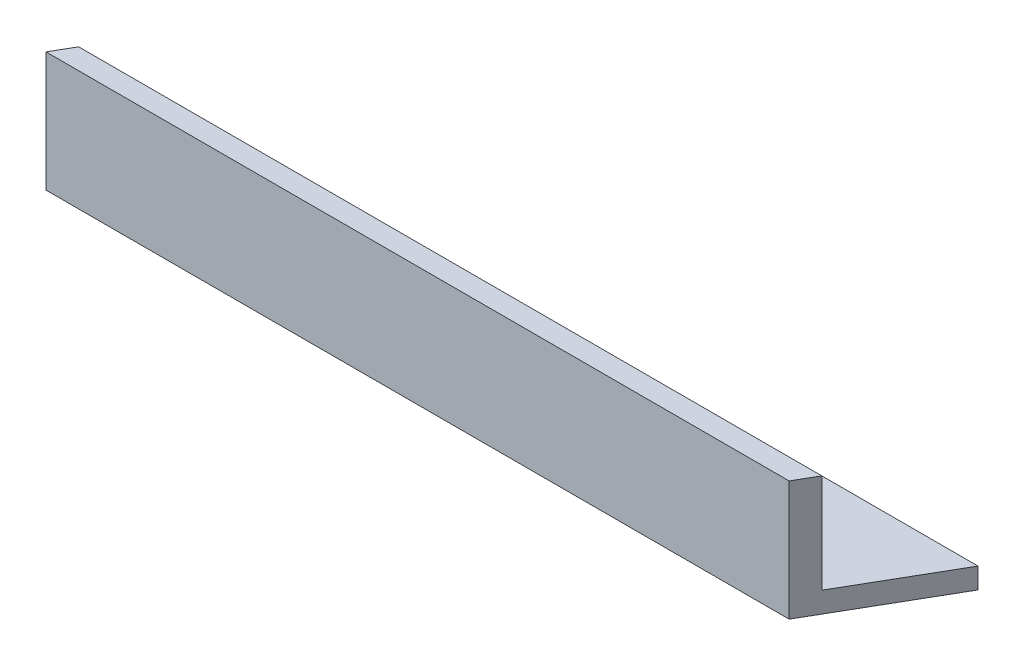
ISO-10303-21;
HEADER;
FILE_DESCRIPTION(('STEP AP214'),'2;1');
FILE_NAME('part.step','',(''),(''),'','','');
FILE_SCHEMA(('AUTOMOTIVE_DESIGN { 1 0 10303 214 1 1 1 1 }'));
ENDSEC;
DATA;
#1=APPLICATION_CONTEXT('core data for automotive mechanical design processes');
#2=APPLICATION_PROTOCOL_DEFINITION('international standard','automotive_design',2000,#1);
#3=PRODUCT_CONTEXT('',#1,'mechanical');
#4=PRODUCT('Part','Part','',(#3));
#5=PRODUCT_RELATED_PRODUCT_CATEGORY('part','',(#4));
#6=PRODUCT_DEFINITION_FORMATION('','',#4);
#7=PRODUCT_DEFINITION_CONTEXT('part definition',#1,'design');
#8=PRODUCT_DEFINITION('design','',#6,#7);
#9=PRODUCT_DEFINITION_SHAPE('','',#8);
#10=(LENGTH_UNIT() NAMED_UNIT(*) SI_UNIT(.MILLI.,.METRE.));
#11=(NAMED_UNIT(*) PLANE_ANGLE_UNIT() SI_UNIT($,.RADIAN.));
#12=(NAMED_UNIT(*) SI_UNIT($,.STERADIAN.) SOLID_ANGLE_UNIT());
#13=UNCERTAINTY_MEASURE_WITH_UNIT(LENGTH_MEASURE(1.E-05),#10,'distance_accuracy_value','');
#14=(GEOMETRIC_REPRESENTATION_CONTEXT(3) GLOBAL_UNCERTAINTY_ASSIGNED_CONTEXT((#13)) GLOBAL_UNIT_ASSIGNED_CONTEXT((#10,
#11,#12)) REPRESENTATION_CONTEXT('',''));
#15=CARTESIAN_POINT('',(0.,0.,0.));
#16=DIRECTION('',(0.,0.,1.));
#17=DIRECTION('',(1.,0.,0.));
#18=AXIS2_PLACEMENT_3D('',#15,#16,#17);
#19=CARTESIAN_POINT('',(240.,20.,0.));
#20=DIRECTION('',(0.,0.,-1.));
#21=DIRECTION('',(0.,1.,0.));
#22=AXIS2_PLACEMENT_3D('',#19,#20,#21);
#23=PLANE('',#22);
#24=DIRECTION('',(-1.,0.,0.));
#25=VECTOR('',#24,1.);
#26=CARTESIAN_POINT('',(240.,0.,0.));
#27=LINE('',#26,#25);
#28=CARTESIAN_POINT('',(124.130307875769,0.,0.));
#29=VERTEX_POINT('',#28);
#30=CARTESIAN_POINT('',(0.,0.,0.));
#31=VERTEX_POINT('',#30);
#32=EDGE_CURVE('E11',#29,#31,#27,.T.);
#33=ORIENTED_EDGE('',*,*,#32,.F.);
#34=DIRECTION('',(0.,-1.,0.));
#35=VECTOR('',#34,1.);
#36=CARTESIAN_POINT('',(124.130307875769,20.,0.));
#37=LINE('',#36,#35);
#38=CARTESIAN_POINT('',(124.130307875769,20.,0.));
#39=VERTEX_POINT('',#38);
#40=EDGE_CURVE('E106',#39,#29,#37,.T.);
#41=ORIENTED_EDGE('',*,*,#40,.F.);
#42=DIRECTION('',(-1.,0.,0.));
#43=VECTOR('',#42,1.);
#44=CARTESIAN_POINT('',(240.,20.,0.));
#45=LINE('',#44,#43);
#46=CARTESIAN_POINT('',(0.,20.,0.));
#47=VERTEX_POINT('',#46);
#48=EDGE_CURVE('E94',#39,#47,#45,.T.);
#49=ORIENTED_EDGE('',*,*,#48,.T.);
#50=DIRECTION('',(0.,-1.,0.));
#51=VECTOR('',#50,1.);
#52=CARTESIAN_POINT('',(0.,20.,0.));
#53=LINE('',#52,#51);
#54=EDGE_CURVE('E86',#47,#31,#53,.T.);
#55=ORIENTED_EDGE('',*,*,#54,.T.);
#56=EDGE_LOOP('',(#33,#41,#49,#55));
#57=FACE_BOUND('',#56,.T.);
#58=ADVANCED_FACE('F37',(#57),#23,.F.);
#59=CARTESIAN_POINT('',(240.,0.,0.));
#60=DIRECTION('',(0.,1.,0.));
#61=DIRECTION('',(0.,0.,1.));
#62=AXIS2_PLACEMENT_3D('',#59,#60,#61);
#63=PLANE('',#62);
#64=ORIENTED_EDGE('',*,*,#32,.T.);
#65=DIRECTION('',(-0.499999999999995,0.,0.866025403784442));
#66=VECTOR('',#65,1.);
#67=CARTESIAN_POINT('',(0.,0.,0.));
#68=LINE('',#67,#66);
#69=CARTESIAN_POINT('',(11.5470053837924,0.,-20.));
#70=VERTEX_POINT('',#69);
#71=EDGE_CURVE('E59',#70,#31,#68,.T.);
#72=ORIENTED_EDGE('',*,*,#71,.F.);
#73=DIRECTION('',(-1.,0.,0.));
#74=VECTOR('',#73,1.);
#75=CARTESIAN_POINT('',(240.,0.,-20.));
#76=LINE('',#75,#74);
#77=CARTESIAN_POINT('',(135.677313259561,0.,-20.));
#78=VERTEX_POINT('',#77);
#79=EDGE_CURVE('E44',#78,#70,#76,.T.);
#80=ORIENTED_EDGE('',*,*,#79,.F.);
#81=DIRECTION('',(0.499999999999994,0.,-0.866025403784442));
#82=VECTOR('',#81,1.);
#83=CARTESIAN_POINT('',(135.677313259561,0.,-20.));
#84=LINE('',#83,#82);
#85=EDGE_CURVE('E127',#29,#78,#84,.T.);
#86=ORIENTED_EDGE('',*,*,#85,.F.);
#87=EDGE_LOOP('',(#64,#72,#80,#86));
#88=FACE_BOUND('',#87,.T.);
#89=ADVANCED_FACE('F126',(#88),#63,.F.);
#90=CARTESIAN_POINT('',(240.,0.,-20.));
#91=DIRECTION('',(0.,0.,1.));
#92=DIRECTION('',(1.,0.,0.));
#93=AXIS2_PLACEMENT_3D('',#90,#91,#92);
#94=PLANE('',#93);
#95=ORIENTED_EDGE('',*,*,#79,.T.);
#96=DIRECTION('',(0.,-1.,0.));
#97=VECTOR('',#96,1.);
#98=CARTESIAN_POINT('',(11.5470053837924,20.,-20.));
#99=LINE('',#98,#97);
#100=CARTESIAN_POINT('',(11.5470053837924,3.46117846701572,-20.));
#101=VERTEX_POINT('',#100);
#102=EDGE_CURVE('E103',#101,#70,#99,.T.);
#103=ORIENTED_EDGE('',*,*,#102,.F.);
#104=DIRECTION('',(-1.,0.,0.));
#105=VECTOR('',#104,1.);
#106=CARTESIAN_POINT('',(240.,3.46117846701572,-20.));
#107=LINE('',#106,#105);
#108=CARTESIAN_POINT('',(135.677313259561,3.46117846701572,-20.));
#109=VERTEX_POINT('',#108);
#110=EDGE_CURVE('E114',#109,#101,#107,.T.);
#111=ORIENTED_EDGE('',*,*,#110,.F.);
#112=DIRECTION('',(0.,-1.,0.));
#113=VECTOR('',#112,1.);
#114=CARTESIAN_POINT('',(135.677313259561,20.,-20.));
#115=LINE('',#114,#113);
#116=EDGE_CURVE('E123',#109,#78,#115,.T.);
#117=ORIENTED_EDGE('',*,*,#116,.T.);
#118=EDGE_LOOP('',(#95,#103,#111,#117));
#119=FACE_BOUND('',#118,.T.);
#120=ADVANCED_FACE('F121',(#119),#94,.F.);
#121=CARTESIAN_POINT('',(240.,3.46117846701572,-20.));
#122=DIRECTION('',(0.,-1.,0.));
#123=DIRECTION('',(0.,0.,-1.));
#124=AXIS2_PLACEMENT_3D('',#121,#122,#123);
#125=PLANE('',#124);
#126=ORIENTED_EDGE('',*,*,#110,.T.);
#127=DIRECTION('',(-0.499999999999995,0.,0.866025403784442));
#128=VECTOR('',#127,1.);
#129=CARTESIAN_POINT('',(68.6602540378431,3.46117846701573,-118.923048454132));
#130=LINE('',#129,#128);
#131=CARTESIAN_POINT('',(1.99831231964481,3.46117846701572,-3.46117846701572));
#132=VERTEX_POINT('',#131);
#133=EDGE_CURVE('E138',#101,#132,#130,.T.);
#134=ORIENTED_EDGE('',*,*,#133,.T.);
#135=DIRECTION('',(-1.,0.,0.));
#136=VECTOR('',#135,1.);
#137=CARTESIAN_POINT('',(240.,3.46117846701572,-3.46117846701572));
#138=LINE('',#137,#136);
#139=CARTESIAN_POINT('',(126.128620195414,3.46117846701572,-3.46117846701572));
#140=VERTEX_POINT('',#139);
#141=EDGE_CURVE('E108',#140,#132,#138,.T.);
#142=ORIENTED_EDGE('',*,*,#141,.F.);
#143=DIRECTION('',(0.499999999999994,0.,-0.866025403784442));
#144=VECTOR('',#143,1.);
#145=CARTESIAN_POINT('',(161.757984944671,3.46117846701572,-65.1730484541326));
#146=LINE('',#145,#144);
#147=EDGE_CURVE('E95',#140,#109,#146,.T.);
#148=ORIENTED_EDGE('',*,*,#147,.T.);
#149=EDGE_LOOP('',(#126,#134,#142,#148));
#150=FACE_BOUND('',#149,.T.);
#151=ADVANCED_FACE('F144',(#150),#125,.F.);
#152=CARTESIAN_POINT('',(240.,3.46117846701572,-3.46117846701572));
#153=DIRECTION('',(0.,0.,1.));
#154=DIRECTION('',(1.,0.,0.));
#155=AXIS2_PLACEMENT_3D('',#152,#153,#154);
#156=PLANE('',#155);
#157=ORIENTED_EDGE('',*,*,#141,.T.);
#158=DIRECTION('',(0.,1.,0.));
#159=VECTOR('',#158,1.);
#160=CARTESIAN_POINT('',(1.99831231964481,3.46117846701572,-3.46117846701572));
#161=LINE('',#160,#159);
#162=CARTESIAN_POINT('',(1.99831231964484,20.,-3.46117846701572));
#163=VERTEX_POINT('',#162);
#164=EDGE_CURVE('E133',#132,#163,#161,.T.);
#165=ORIENTED_EDGE('',*,*,#164,.T.);
#166=DIRECTION('',(-1.,0.,0.));
#167=VECTOR('',#166,1.);
#168=CARTESIAN_POINT('',(240.,20.,-3.46117846701572));
#169=LINE('',#168,#167);
#170=CARTESIAN_POINT('',(126.128620195414,20.,-3.46117846701572));
#171=VERTEX_POINT('',#170);
#172=EDGE_CURVE('E102',#171,#163,#169,.T.);
#173=ORIENTED_EDGE('',*,*,#172,.F.);
#174=DIRECTION('',(0.,-1.,0.));
#175=VECTOR('',#174,1.);
#176=CARTESIAN_POINT('',(126.128620195414,3.46117846701572,-3.46117846701572));
#177=LINE('',#176,#175);
#178=EDGE_CURVE('E51',#171,#140,#177,.T.);
#179=ORIENTED_EDGE('',*,*,#178,.T.);
#180=EDGE_LOOP('',(#157,#165,#173,#179));
#181=FACE_BOUND('',#180,.T.);
#182=ADVANCED_FACE('F147',(#181),#156,.F.);
#183=CARTESIAN_POINT('',(240.,20.,-3.46117846701572));
#184=DIRECTION('',(0.,-1.,0.));
#185=DIRECTION('',(0.,0.,-1.));
#186=AXIS2_PLACEMENT_3D('',#183,#184,#185);
#187=PLANE('',#186);
#188=ORIENTED_EDGE('',*,*,#172,.T.);
#189=DIRECTION('',(-0.499999999999995,0.,0.866025403784442));
#190=VECTOR('',#189,1.);
#191=CARTESIAN_POINT('',(0.,20.,0.));
#192=LINE('',#191,#190);
#193=EDGE_CURVE('E89',#163,#47,#192,.T.);
#194=ORIENTED_EDGE('',*,*,#193,.T.);
#195=ORIENTED_EDGE('',*,*,#48,.F.);
#196=DIRECTION('',(0.499999999999994,0.,-0.866025403784442));
#197=VECTOR('',#196,1.);
#198=CARTESIAN_POINT('',(135.677313259561,20.,-20.));
#199=LINE('',#198,#197);
#200=EDGE_CURVE('E129',#39,#171,#199,.T.);
#201=ORIENTED_EDGE('',*,*,#200,.T.);
#202=EDGE_LOOP('',(#188,#194,#195,#201));
#203=FACE_BOUND('',#202,.T.);
#204=ADVANCED_FACE('F100',(#203),#187,.F.);
#205=CARTESIAN_POINT('',(0.,20.,0.));
#206=DIRECTION('',(0.866025403784442,0.,0.499999999999995));
#207=DIRECTION('',(0.499999999999995,0.,-0.866025403784442));
#208=AXIS2_PLACEMENT_3D('',#205,#206,#207);
#209=PLANE('',#208);
#210=ORIENTED_EDGE('',*,*,#102,.T.);
#211=ORIENTED_EDGE('',*,*,#71,.T.);
#212=ORIENTED_EDGE('',*,*,#54,.F.);
#213=ORIENTED_EDGE('',*,*,#193,.F.);
#214=ORIENTED_EDGE('',*,*,#164,.F.);
#215=ORIENTED_EDGE('',*,*,#133,.F.);
#216=EDGE_LOOP('',(#210,#211,#212,#213,#214,#215));
#217=FACE_BOUND('',#216,.T.);
#218=ADVANCED_FACE('F88',(#217),#209,.F.);
#219=CARTESIAN_POINT('',(135.677313259561,20.,-20.));
#220=DIRECTION('',(-0.866025403784442,0.,-0.499999999999994));
#221=DIRECTION('',(-0.499999999999994,0.,0.866025403784442));
#222=AXIS2_PLACEMENT_3D('',#219,#220,#221);
#223=PLANE('',#222);
#224=ORIENTED_EDGE('',*,*,#178,.F.);
#225=ORIENTED_EDGE('',*,*,#200,.F.);
#226=ORIENTED_EDGE('',*,*,#40,.T.);
#227=ORIENTED_EDGE('',*,*,#85,.T.);
#228=ORIENTED_EDGE('',*,*,#116,.F.);
#229=ORIENTED_EDGE('',*,*,#147,.F.);
#230=EDGE_LOOP('',(#224,#225,#226,#227,#228,#229));
#231=FACE_BOUND('',#230,.T.);
#232=ADVANCED_FACE('F145',(#231),#223,.F.);
#233=CLOSED_SHELL('',(#58,#89,#120,#151,#182,#204,#218,#232));
#234=MANIFOLD_SOLID_BREP('B2',#233);
#235=ADVANCED_BREP_SHAPE_REPRESENTATION('',(#18,#234),#14);
#236=SHAPE_DEFINITION_REPRESENTATION(#9,#235);
ENDSEC;
END-ISO-10303-21;
